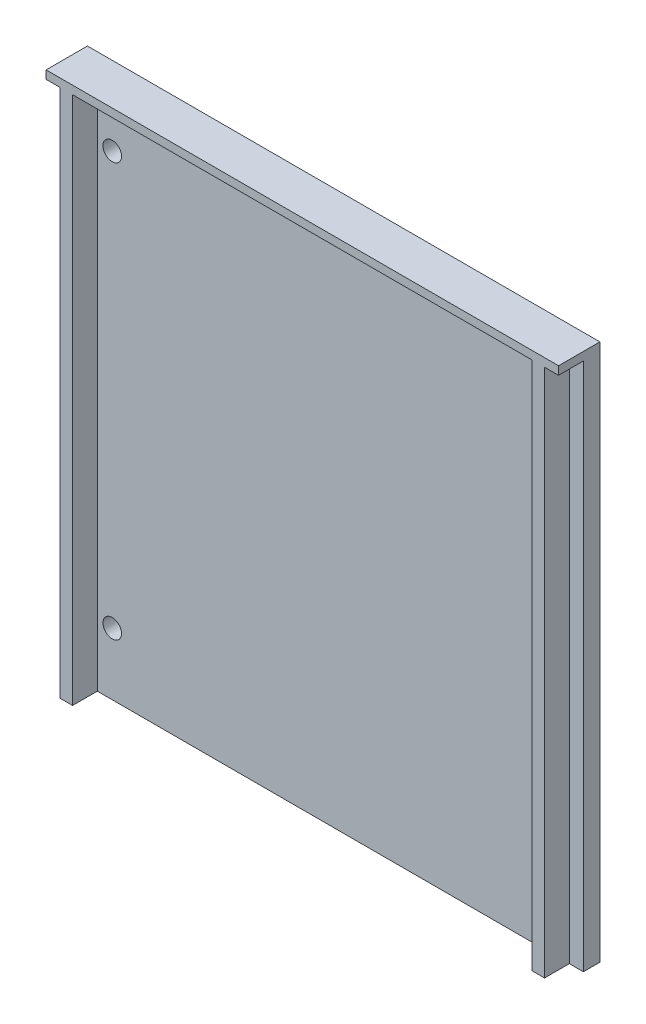
ISO-10303-21;
HEADER;
FILE_DESCRIPTION(('STEP AP214'),'2;1');
FILE_NAME('part.step','',(''),(''),'','','');
FILE_SCHEMA(('AUTOMOTIVE_DESIGN { 1 0 10303 214 1 1 1 1 }'));
ENDSEC;
DATA;
#1=APPLICATION_CONTEXT('core data for automotive mechanical design processes');
#2=APPLICATION_PROTOCOL_DEFINITION('international standard','automotive_design',2000,#1);
#3=PRODUCT_CONTEXT('',#1,'mechanical');
#4=PRODUCT('Part','Part','',(#3));
#5=PRODUCT_RELATED_PRODUCT_CATEGORY('part','',(#4));
#6=PRODUCT_DEFINITION_FORMATION('','',#4);
#7=PRODUCT_DEFINITION_CONTEXT('part definition',#1,'design');
#8=PRODUCT_DEFINITION('design','',#6,#7);
#9=PRODUCT_DEFINITION_SHAPE('','',#8);
#10=(LENGTH_UNIT() NAMED_UNIT(*) SI_UNIT(.MILLI.,.METRE.));
#11=(NAMED_UNIT(*) PLANE_ANGLE_UNIT() SI_UNIT($,.RADIAN.));
#12=(NAMED_UNIT(*) SI_UNIT($,.STERADIAN.) SOLID_ANGLE_UNIT());
#13=UNCERTAINTY_MEASURE_WITH_UNIT(LENGTH_MEASURE(1.E-05),#10,'distance_accuracy_value','');
#14=(GEOMETRIC_REPRESENTATION_CONTEXT(3) GLOBAL_UNCERTAINTY_ASSIGNED_CONTEXT((#13)) GLOBAL_UNIT_ASSIGNED_CONTEXT((#10,
#11,#12)) REPRESENTATION_CONTEXT('',''));
#15=CARTESIAN_POINT('',(0.,0.,0.));
#16=DIRECTION('',(0.,0.,1.));
#17=DIRECTION('',(1.,0.,0.));
#18=AXIS2_PLACEMENT_3D('',#15,#16,#17);
#19=CARTESIAN_POINT('',(-62.,63.,4.));
#20=DIRECTION('',(0.,1.,0.));
#21=DIRECTION('',(1.,0.,0.));
#22=AXIS2_PLACEMENT_3D('',#19,#20,#21);
#23=PLANE('',#22);
#24=DIRECTION('',(0.,0.,1.));
#25=VECTOR('',#24,1.);
#26=CARTESIAN_POINT('',(62.,63.,4.));
#27=LINE('',#26,#25);
#28=CARTESIAN_POINT('',(62.,63.,4.));
#29=VERTEX_POINT('',#28);
#30=CARTESIAN_POINT('',(62.,63.,10.));
#31=VERTEX_POINT('',#30);
#32=EDGE_CURVE('E10',#29,#31,#27,.T.);
#33=ORIENTED_EDGE('',*,*,#32,.T.);
#34=DIRECTION('',(1.,0.,0.));
#35=VECTOR('',#34,1.);
#36=CARTESIAN_POINT('',(-62.,63.,10.));
#37=LINE('',#36,#35);
#38=CARTESIAN_POINT('',(58.6,63.,10.));
#39=VERTEX_POINT('',#38);
#40=EDGE_CURVE('E164',#39,#31,#37,.T.);
#41=ORIENTED_EDGE('',*,*,#40,.F.);
#42=DIRECTION('',(0.,0.,1.));
#43=VECTOR('',#42,1.);
#44=CARTESIAN_POINT('',(58.6,63.,4.));
#45=LINE('',#44,#43);
#46=CARTESIAN_POINT('',(58.6,63.,4.));
#47=VERTEX_POINT('',#46);
#48=EDGE_CURVE('E145',#47,#39,#45,.T.);
#49=ORIENTED_EDGE('',*,*,#48,.F.);
#50=DIRECTION('',(1.,0.,0.));
#51=VECTOR('',#50,1.);
#52=CARTESIAN_POINT('',(-62.,63.,4.));
#53=LINE('',#52,#51);
#54=EDGE_CURVE('E146',#47,#29,#53,.T.);
#55=ORIENTED_EDGE('',*,*,#54,.T.);
#56=EDGE_LOOP('',(#33,#41,#49,#55));
#57=FACE_BOUND('',#56,.T.);
#58=ADVANCED_FACE('F16',(#57),#23,.F.);
#59=CARTESIAN_POINT('',(-62.,63.,4.));
#60=DIRECTION('',(0.,1.,0.));
#61=DIRECTION('',(1.,0.,0.));
#62=AXIS2_PLACEMENT_3D('',#59,#60,#61);
#63=PLANE('',#62);
#64=DIRECTION('',(0.,0.,1.));
#65=VECTOR('',#64,1.);
#66=CARTESIAN_POINT('',(55.6,63.,4.));
#67=LINE('',#66,#65);
#68=CARTESIAN_POINT('',(55.6,63.,4.));
#69=VERTEX_POINT('',#68);
#70=CARTESIAN_POINT('',(55.6,63.,10.));
#71=VERTEX_POINT('',#70);
#72=EDGE_CURVE('E100',#69,#71,#67,.T.);
#73=ORIENTED_EDGE('',*,*,#72,.T.);
#74=DIRECTION('',(1.,0.,0.));
#75=VECTOR('',#74,1.);
#76=CARTESIAN_POINT('',(-62.,63.,10.));
#77=LINE('',#76,#75);
#78=CARTESIAN_POINT('',(-55.6,63.,10.));
#79=VERTEX_POINT('',#78);
#80=EDGE_CURVE('E311',#79,#71,#77,.T.);
#81=ORIENTED_EDGE('',*,*,#80,.F.);
#82=DIRECTION('',(0.,0.,1.));
#83=VECTOR('',#82,1.);
#84=CARTESIAN_POINT('',(-55.6,63.,4.));
#85=LINE('',#84,#83);
#86=CARTESIAN_POINT('',(-55.6,63.,4.));
#87=VERTEX_POINT('',#86);
#88=EDGE_CURVE('E121',#87,#79,#85,.T.);
#89=ORIENTED_EDGE('',*,*,#88,.F.);
#90=DIRECTION('',(1.,0.,0.));
#91=VECTOR('',#90,1.);
#92=CARTESIAN_POINT('',(-62.,63.,4.));
#93=LINE('',#92,#91);
#94=EDGE_CURVE('E93',#87,#69,#93,.T.);
#95=ORIENTED_EDGE('',*,*,#94,.T.);
#96=EDGE_LOOP('',(#73,#81,#89,#95));
#97=FACE_BOUND('',#96,.T.);
#98=ADVANCED_FACE('F18',(#97),#63,.F.);
#99=CARTESIAN_POINT('',(52.,50.,-1.));
#100=DIRECTION('',(0.,0.,1.));
#101=DIRECTION('',(1.,0.,0.));
#102=AXIS2_PLACEMENT_3D('',#99,#100,#101);
#103=CYLINDRICAL_SURFACE('',#102,2.25);
#104=CARTESIAN_POINT('',(52.,50.,4.));
#105=DIRECTION('',(0.,0.,1.));
#106=DIRECTION('',(1.,0.,0.));
#107=AXIS2_PLACEMENT_3D('',#104,#105,#106);
#108=CIRCLE('',#107,2.25);
#109=CARTESIAN_POINT('',(54.25,50.,4.));
#110=VERTEX_POINT('',#109);
#111=EDGE_CURVE('E112',#110,#110,#108,.T.);
#112=ORIENTED_EDGE('',*,*,#111,.T.);
#113=EDGE_LOOP('',(#112));
#114=FACE_BOUND('',#113,.T.);
#115=CARTESIAN_POINT('',(52.,50.,0.));
#116=DIRECTION('',(0.,0.,1.));
#117=DIRECTION('',(1.,0.,0.));
#118=AXIS2_PLACEMENT_3D('',#115,#116,#117);
#119=CIRCLE('',#118,2.25);
#120=CARTESIAN_POINT('',(54.25,50.,0.));
#121=VERTEX_POINT('',#120);
#122=EDGE_CURVE('E292',#121,#121,#119,.T.);
#123=ORIENTED_EDGE('',*,*,#122,.F.);
#124=EDGE_LOOP('',(#123));
#125=FACE_BOUND('',#124,.T.);
#126=ADVANCED_FACE('F412',(#114,#125),#103,.F.);
#127=CARTESIAN_POINT('',(-52.,50.,-1.));
#128=DIRECTION('',(0.,0.,1.));
#129=DIRECTION('',(1.,0.,0.));
#130=AXIS2_PLACEMENT_3D('',#127,#128,#129);
#131=CYLINDRICAL_SURFACE('',#130,2.25);
#132=CARTESIAN_POINT('',(-52.,50.,4.));
#133=DIRECTION('',(0.,0.,1.));
#134=DIRECTION('',(1.,0.,0.));
#135=AXIS2_PLACEMENT_3D('',#132,#133,#134);
#136=CIRCLE('',#135,2.25);
#137=CARTESIAN_POINT('',(-49.75,50.,4.));
#138=VERTEX_POINT('',#137);
#139=EDGE_CURVE('E138',#138,#138,#136,.T.);
#140=ORIENTED_EDGE('',*,*,#139,.T.);
#141=EDGE_LOOP('',(#140));
#142=FACE_BOUND('',#141,.T.);
#143=CARTESIAN_POINT('',(-52.,50.,0.));
#144=DIRECTION('',(0.,0.,1.));
#145=DIRECTION('',(1.,0.,0.));
#146=AXIS2_PLACEMENT_3D('',#143,#144,#145);
#147=CIRCLE('',#146,2.25);
#148=CARTESIAN_POINT('',(-49.75,50.,0.));
#149=VERTEX_POINT('',#148);
#150=EDGE_CURVE('E288',#149,#149,#147,.T.);
#151=ORIENTED_EDGE('',*,*,#150,.F.);
#152=EDGE_LOOP('',(#151));
#153=FACE_BOUND('',#152,.T.);
#154=ADVANCED_FACE('F423',(#142,#153),#131,.F.);
#155=CARTESIAN_POINT('',(52.,-50.,-1.));
#156=DIRECTION('',(0.,0.,1.));
#157=DIRECTION('',(1.,0.,0.));
#158=AXIS2_PLACEMENT_3D('',#155,#156,#157);
#159=CYLINDRICAL_SURFACE('',#158,2.25);
#160=CARTESIAN_POINT('',(52.,-50.,4.));
#161=DIRECTION('',(0.,0.,1.));
#162=DIRECTION('',(1.,0.,0.));
#163=AXIS2_PLACEMENT_3D('',#160,#161,#162);
#164=CIRCLE('',#163,2.25);
#165=CARTESIAN_POINT('',(54.25,-50.,4.));
#166=VERTEX_POINT('',#165);
#167=EDGE_CURVE('E134',#166,#166,#164,.T.);
#168=ORIENTED_EDGE('',*,*,#167,.T.);
#169=EDGE_LOOP('',(#168));
#170=FACE_BOUND('',#169,.T.);
#171=CARTESIAN_POINT('',(52.,-50.,0.));
#172=DIRECTION('',(0.,0.,1.));
#173=DIRECTION('',(1.,0.,0.));
#174=AXIS2_PLACEMENT_3D('',#171,#172,#173);
#175=CIRCLE('',#174,2.25);
#176=CARTESIAN_POINT('',(54.25,-50.,0.));
#177=VERTEX_POINT('',#176);
#178=EDGE_CURVE('E284',#177,#177,#175,.T.);
#179=ORIENTED_EDGE('',*,*,#178,.F.);
#180=EDGE_LOOP('',(#179));
#181=FACE_BOUND('',#180,.T.);
#182=ADVANCED_FACE('F403',(#170,#181),#159,.F.);
#183=CARTESIAN_POINT('',(-52.,-50.,-1.));
#184=DIRECTION('',(0.,0.,1.));
#185=DIRECTION('',(1.,0.,0.));
#186=AXIS2_PLACEMENT_3D('',#183,#184,#185);
#187=CYLINDRICAL_SURFACE('',#186,2.25);
#188=CARTESIAN_POINT('',(-52.,-50.,4.));
#189=DIRECTION('',(0.,0.,1.));
#190=DIRECTION('',(1.,0.,0.));
#191=AXIS2_PLACEMENT_3D('',#188,#189,#190);
#192=CIRCLE('',#191,2.25);
#193=CARTESIAN_POINT('',(-49.75,-50.,4.));
#194=VERTEX_POINT('',#193);
#195=EDGE_CURVE('E119',#194,#194,#192,.T.);
#196=ORIENTED_EDGE('',*,*,#195,.T.);
#197=EDGE_LOOP('',(#196));
#198=FACE_BOUND('',#197,.T.);
#199=CARTESIAN_POINT('',(-52.,-50.,0.));
#200=DIRECTION('',(0.,0.,1.));
#201=DIRECTION('',(1.,0.,0.));
#202=AXIS2_PLACEMENT_3D('',#199,#200,#201);
#203=CIRCLE('',#202,2.25);
#204=CARTESIAN_POINT('',(-49.75,-50.,0.));
#205=VERTEX_POINT('',#204);
#206=EDGE_CURVE('E280',#205,#205,#203,.T.);
#207=ORIENTED_EDGE('',*,*,#206,.F.);
#208=EDGE_LOOP('',(#207));
#209=FACE_BOUND('',#208,.T.);
#210=ADVANCED_FACE('F395',(#198,#209),#187,.F.);
#211=CARTESIAN_POINT('',(-62.,63.,4.));
#212=DIRECTION('',(0.,1.,0.));
#213=DIRECTION('',(1.,0.,0.));
#214=AXIS2_PLACEMENT_3D('',#211,#212,#213);
#215=PLANE('',#214);
#216=DIRECTION('',(0.,0.,1.));
#217=VECTOR('',#216,1.);
#218=CARTESIAN_POINT('',(-58.6,63.,4.));
#219=LINE('',#218,#217);
#220=CARTESIAN_POINT('',(-58.6,63.,4.));
#221=VERTEX_POINT('',#220);
#222=CARTESIAN_POINT('',(-58.6,63.,10.));
#223=VERTEX_POINT('',#222);
#224=EDGE_CURVE('E232',#221,#223,#219,.T.);
#225=ORIENTED_EDGE('',*,*,#224,.T.);
#226=DIRECTION('',(1.,0.,0.));
#227=VECTOR('',#226,1.);
#228=CARTESIAN_POINT('',(-62.,63.,10.));
#229=LINE('',#228,#227);
#230=CARTESIAN_POINT('',(-62.,63.,10.));
#231=VERTEX_POINT('',#230);
#232=EDGE_CURVE('E263',#231,#223,#229,.T.);
#233=ORIENTED_EDGE('',*,*,#232,.F.);
#234=DIRECTION('',(0.,0.,1.));
#235=VECTOR('',#234,1.);
#236=CARTESIAN_POINT('',(-62.,63.,4.));
#237=LINE('',#236,#235);
#238=CARTESIAN_POINT('',(-62.,63.,4.));
#239=VERTEX_POINT('',#238);
#240=EDGE_CURVE('E375',#239,#231,#237,.T.);
#241=ORIENTED_EDGE('',*,*,#240,.F.);
#242=DIRECTION('',(1.,0.,0.));
#243=VECTOR('',#242,1.);
#244=CARTESIAN_POINT('',(-62.,63.,4.));
#245=LINE('',#244,#243);
#246=EDGE_CURVE('E237',#239,#221,#245,.T.);
#247=ORIENTED_EDGE('',*,*,#246,.T.);
#248=EDGE_LOOP('',(#225,#233,#241,#247));
#249=FACE_BOUND('',#248,.T.);
#250=ADVANCED_FACE('F393',(#249),#215,.F.);
#251=CARTESIAN_POINT('',(62.,-65.,0.));
#252=DIRECTION('',(1.,0.,0.));
#253=DIRECTION('',(0.,1.,0.));
#254=AXIS2_PLACEMENT_3D('',#251,#252,#253);
#255=PLANE('',#254);
#256=DIRECTION('',(0.,0.,1.));
#257=VECTOR('',#256,1.);
#258=CARTESIAN_POINT('',(62.,-65.,0.));
#259=LINE('',#258,#257);
#260=CARTESIAN_POINT('',(62.,-65.,0.));
#261=VERTEX_POINT('',#260);
#262=CARTESIAN_POINT('',(62.,-65.,4.));
#263=VERTEX_POINT('',#262);
#264=EDGE_CURVE('E342',#261,#263,#259,.T.);
#265=ORIENTED_EDGE('',*,*,#264,.F.);
#266=DIRECTION('',(0.,1.,0.));
#267=VECTOR('',#266,1.);
#268=CARTESIAN_POINT('',(62.,-65.,0.));
#269=LINE('',#268,#267);
#270=CARTESIAN_POINT('',(62.,65.,0.));
#271=VERTEX_POINT('',#270);
#272=EDGE_CURVE('E279',#261,#271,#269,.T.);
#273=ORIENTED_EDGE('',*,*,#272,.T.);
#274=DIRECTION('',(0.,0.,-1.));
#275=VECTOR('',#274,1.);
#276=CARTESIAN_POINT('',(62.,65.,10.));
#277=LINE('',#276,#275);
#278=CARTESIAN_POINT('',(62.,65.,10.));
#279=VERTEX_POINT('',#278);
#280=EDGE_CURVE('E275',#279,#271,#277,.T.);
#281=ORIENTED_EDGE('',*,*,#280,.F.);
#282=DIRECTION('',(0.,1.,0.));
#283=VECTOR('',#282,1.);
#284=CARTESIAN_POINT('',(62.,63.,10.));
#285=LINE('',#284,#283);
#286=EDGE_CURVE('E265',#31,#279,#285,.T.);
#287=ORIENTED_EDGE('',*,*,#286,.F.);
#288=ORIENTED_EDGE('',*,*,#32,.F.);
#289=DIRECTION('',(0.,1.,0.));
#290=VECTOR('',#289,1.);
#291=CARTESIAN_POINT('',(62.,-65.,4.));
#292=LINE('',#291,#290);
#293=EDGE_CURVE('E26',#263,#29,#292,.T.);
#294=ORIENTED_EDGE('',*,*,#293,.F.);
#295=EDGE_LOOP('',(#265,#273,#281,#287,#288,#294));
#296=FACE_BOUND('',#295,.T.);
#297=ADVANCED_FACE('F354',(#296),#255,.T.);
#298=CARTESIAN_POINT('',(-62.,-65.,4.));
#299=DIRECTION('',(0.,0.,1.));
#300=DIRECTION('',(1.,0.,0.));
#301=AXIS2_PLACEMENT_3D('',#298,#299,#300);
#302=PLANE('',#301);
#303=ORIENTED_EDGE('',*,*,#54,.F.);
#304=DIRECTION('',(0.,1.,0.));
#305=VECTOR('',#304,1.);
#306=CARTESIAN_POINT('',(58.6,-65.,4.));
#307=LINE('',#306,#305);
#308=CARTESIAN_POINT('',(58.6,-65.,4.));
#309=VERTEX_POINT('',#308);
#310=EDGE_CURVE('E111',#309,#47,#307,.T.);
#311=ORIENTED_EDGE('',*,*,#310,.F.);
#312=DIRECTION('',(1.,0.,0.));
#313=VECTOR('',#312,1.);
#314=CARTESIAN_POINT('',(-62.,-65.,4.));
#315=LINE('',#314,#313);
#316=EDGE_CURVE('E158',#309,#263,#315,.T.);
#317=ORIENTED_EDGE('',*,*,#316,.T.);
#318=ORIENTED_EDGE('',*,*,#293,.T.);
#319=EDGE_LOOP('',(#303,#311,#317,#318));
#320=FACE_BOUND('',#319,.T.);
#321=ADVANCED_FACE('F153',(#320),#302,.T.);
#322=CARTESIAN_POINT('',(58.6,-65.,4.));
#323=DIRECTION('',(1.,0.,0.));
#324=DIRECTION('',(0.,1.,0.));
#325=AXIS2_PLACEMENT_3D('',#322,#323,#324);
#326=PLANE('',#325);
#327=DIRECTION('',(0.,1.,0.));
#328=VECTOR('',#327,1.);
#329=CARTESIAN_POINT('',(58.6,-65.,10.));
#330=LINE('',#329,#328);
#331=CARTESIAN_POINT('',(58.6,-65.,10.));
#332=VERTEX_POINT('',#331);
#333=EDGE_CURVE('E293',#332,#39,#330,.T.);
#334=ORIENTED_EDGE('',*,*,#333,.F.);
#335=DIRECTION('',(0.,0.,1.));
#336=VECTOR('',#335,1.);
#337=CARTESIAN_POINT('',(58.6,-65.,4.));
#338=LINE('',#337,#336);
#339=EDGE_CURVE('E174',#309,#332,#338,.T.);
#340=ORIENTED_EDGE('',*,*,#339,.F.);
#341=ORIENTED_EDGE('',*,*,#310,.T.);
#342=ORIENTED_EDGE('',*,*,#48,.T.);
#343=EDGE_LOOP('',(#334,#340,#341,#342));
#344=FACE_BOUND('',#343,.T.);
#345=ADVANCED_FACE('F171',(#344),#326,.T.);
#346=CARTESIAN_POINT('',(55.6,-65.,4.));
#347=DIRECTION('',(1.,0.,0.));
#348=DIRECTION('',(0.,1.,0.));
#349=AXIS2_PLACEMENT_3D('',#346,#347,#348);
#350=PLANE('',#349);
#351=ORIENTED_EDGE('',*,*,#72,.F.);
#352=DIRECTION('',(0.,1.,0.));
#353=VECTOR('',#352,1.);
#354=CARTESIAN_POINT('',(55.6,-65.,4.));
#355=LINE('',#354,#353);
#356=CARTESIAN_POINT('',(55.6,-65.,4.));
#357=VERTEX_POINT('',#356);
#358=EDGE_CURVE('E103',#357,#69,#355,.T.);
#359=ORIENTED_EDGE('',*,*,#358,.F.);
#360=DIRECTION('',(0.,0.,1.));
#361=VECTOR('',#360,1.);
#362=CARTESIAN_POINT('',(55.6,-65.,4.));
#363=LINE('',#362,#361);
#364=CARTESIAN_POINT('',(55.6,-65.,10.));
#365=VERTEX_POINT('',#364);
#366=EDGE_CURVE('E327',#357,#365,#363,.T.);
#367=ORIENTED_EDGE('',*,*,#366,.T.);
#368=DIRECTION('',(0.,1.,0.));
#369=VECTOR('',#368,1.);
#370=CARTESIAN_POINT('',(55.6,-65.,10.));
#371=LINE('',#370,#369);
#372=EDGE_CURVE('E106',#365,#71,#371,.T.);
#373=ORIENTED_EDGE('',*,*,#372,.T.);
#374=EDGE_LOOP('',(#351,#359,#367,#373));
#375=FACE_BOUND('',#374,.T.);
#376=ADVANCED_FACE('F101',(#375),#350,.F.);
#377=CARTESIAN_POINT('',(-62.,-65.,4.));
#378=DIRECTION('',(0.,0.,1.));
#379=DIRECTION('',(1.,0.,0.));
#380=AXIS2_PLACEMENT_3D('',#377,#378,#379);
#381=PLANE('',#380);
#382=ORIENTED_EDGE('',*,*,#111,.F.);
#383=EDGE_LOOP('',(#382));
#384=FACE_BOUND('',#383,.T.);
#385=ORIENTED_EDGE('',*,*,#139,.F.);
#386=EDGE_LOOP('',(#385));
#387=FACE_BOUND('',#386,.T.);
#388=ORIENTED_EDGE('',*,*,#167,.F.);
#389=EDGE_LOOP('',(#388));
#390=FACE_BOUND('',#389,.T.);
#391=ORIENTED_EDGE('',*,*,#195,.F.);
#392=EDGE_LOOP('',(#391));
#393=FACE_BOUND('',#392,.T.);
#394=ORIENTED_EDGE('',*,*,#94,.F.);
#395=DIRECTION('',(0.,1.,0.));
#396=VECTOR('',#395,1.);
#397=CARTESIAN_POINT('',(-55.6,-65.,4.));
#398=LINE('',#397,#396);
#399=CARTESIAN_POINT('',(-55.6,-65.,4.));
#400=VERTEX_POINT('',#399);
#401=EDGE_CURVE('E127',#400,#87,#398,.T.);
#402=ORIENTED_EDGE('',*,*,#401,.F.);
#403=DIRECTION('',(1.,0.,0.));
#404=VECTOR('',#403,1.);
#405=CARTESIAN_POINT('',(-62.,-65.,4.));
#406=LINE('',#405,#404);
#407=EDGE_CURVE('E116',#400,#357,#406,.T.);
#408=ORIENTED_EDGE('',*,*,#407,.T.);
#409=ORIENTED_EDGE('',*,*,#358,.T.);
#410=EDGE_LOOP('',(#394,#402,#408,#409));
#411=FACE_BOUND('',#410,.T.);
#412=ADVANCED_FACE('F114',(#384,#387,#390,#393,#411),#381,.T.);
#413=CARTESIAN_POINT('',(-55.6,-65.,4.));
#414=DIRECTION('',(1.,0.,0.));
#415=DIRECTION('',(0.,1.,0.));
#416=AXIS2_PLACEMENT_3D('',#413,#414,#415);
#417=PLANE('',#416);
#418=DIRECTION('',(0.,1.,0.));
#419=VECTOR('',#418,1.);
#420=CARTESIAN_POINT('',(-55.6,-65.,10.));
#421=LINE('',#420,#419);
#422=CARTESIAN_POINT('',(-55.6,-65.,10.));
#423=VERTEX_POINT('',#422);
#424=EDGE_CURVE('E307',#423,#79,#421,.T.);
#425=ORIENTED_EDGE('',*,*,#424,.F.);
#426=DIRECTION('',(0.,0.,1.));
#427=VECTOR('',#426,1.);
#428=CARTESIAN_POINT('',(-55.6,-65.,4.));
#429=LINE('',#428,#427);
#430=EDGE_CURVE('E259',#400,#423,#429,.T.);
#431=ORIENTED_EDGE('',*,*,#430,.F.);
#432=ORIENTED_EDGE('',*,*,#401,.T.);
#433=ORIENTED_EDGE('',*,*,#88,.T.);
#434=EDGE_LOOP('',(#425,#431,#432,#433));
#435=FACE_BOUND('',#434,.T.);
#436=ADVANCED_FACE('F323',(#435),#417,.T.);
#437=CARTESIAN_POINT('',(-58.6,-65.,10.));
#438=DIRECTION('',(0.,0.,1.));
#439=DIRECTION('',(1.,0.,0.));
#440=AXIS2_PLACEMENT_3D('',#437,#438,#439);
#441=PLANE('',#440);
#442=DIRECTION('',(0.,1.,0.));
#443=VECTOR('',#442,1.);
#444=CARTESIAN_POINT('',(-58.6,-65.,10.));
#445=LINE('',#444,#443);
#446=CARTESIAN_POINT('',(-58.6,-65.,10.));
#447=VERTEX_POINT('',#446);
#448=EDGE_CURVE('E304',#447,#223,#445,.T.);
#449=ORIENTED_EDGE('',*,*,#448,.F.);
#450=DIRECTION('',(1.,0.,0.));
#451=VECTOR('',#450,1.);
#452=CARTESIAN_POINT('',(-58.6,-65.,10.));
#453=LINE('',#452,#451);
#454=EDGE_CURVE('E253',#447,#423,#453,.T.);
#455=ORIENTED_EDGE('',*,*,#454,.T.);
#456=ORIENTED_EDGE('',*,*,#424,.T.);
#457=ORIENTED_EDGE('',*,*,#80,.T.);
#458=ORIENTED_EDGE('',*,*,#372,.F.);
#459=DIRECTION('',(1.,0.,0.));
#460=VECTOR('',#459,1.);
#461=CARTESIAN_POINT('',(55.6,-65.,10.));
#462=LINE('',#461,#460);
#463=EDGE_CURVE('E334',#365,#332,#462,.T.);
#464=ORIENTED_EDGE('',*,*,#463,.T.);
#465=ORIENTED_EDGE('',*,*,#333,.T.);
#466=ORIENTED_EDGE('',*,*,#40,.T.);
#467=ORIENTED_EDGE('',*,*,#286,.T.);
#468=DIRECTION('',(1.,0.,0.));
#469=VECTOR('',#468,1.);
#470=CARTESIAN_POINT('',(-62.,65.,10.));
#471=LINE('',#470,#469);
#472=CARTESIAN_POINT('',(-62.,65.,10.));
#473=VERTEX_POINT('',#472);
#474=EDGE_CURVE('E271',#473,#279,#471,.T.);
#475=ORIENTED_EDGE('',*,*,#474,.F.);
#476=DIRECTION('',(0.,1.,0.));
#477=VECTOR('',#476,1.);
#478=CARTESIAN_POINT('',(-62.,63.,10.));
#479=LINE('',#478,#477);
#480=EDGE_CURVE('E369',#231,#473,#479,.T.);
#481=ORIENTED_EDGE('',*,*,#480,.F.);
#482=ORIENTED_EDGE('',*,*,#232,.T.);
#483=EDGE_LOOP('',(#449,#455,#456,#457,#458,#464,#465,#466,#467,#475,#481,#482));
#484=FACE_BOUND('',#483,.T.);
#485=ADVANCED_FACE('F380',(#484),#441,.T.);
#486=CARTESIAN_POINT('',(-58.6,-65.,4.));
#487=DIRECTION('',(1.,0.,0.));
#488=DIRECTION('',(0.,1.,0.));
#489=AXIS2_PLACEMENT_3D('',#486,#487,#488);
#490=PLANE('',#489);
#491=ORIENTED_EDGE('',*,*,#224,.F.);
#492=DIRECTION('',(0.,1.,0.));
#493=VECTOR('',#492,1.);
#494=CARTESIAN_POINT('',(-58.6,-65.,4.));
#495=LINE('',#494,#493);
#496=CARTESIAN_POINT('',(-58.6,-65.,4.));
#497=VERTEX_POINT('',#496);
#498=EDGE_CURVE('E224',#497,#221,#495,.T.);
#499=ORIENTED_EDGE('',*,*,#498,.F.);
#500=DIRECTION('',(0.,0.,1.));
#501=VECTOR('',#500,1.);
#502=CARTESIAN_POINT('',(-58.6,-65.,4.));
#503=LINE('',#502,#501);
#504=EDGE_CURVE('E229',#497,#447,#503,.T.);
#505=ORIENTED_EDGE('',*,*,#504,.T.);
#506=ORIENTED_EDGE('',*,*,#448,.T.);
#507=EDGE_LOOP('',(#491,#499,#505,#506));
#508=FACE_BOUND('',#507,.T.);
#509=ADVANCED_FACE('F226',(#508),#490,.F.);
#510=CARTESIAN_POINT('',(-62.,-65.,0.));
#511=DIRECTION('',(0.,0.,1.));
#512=DIRECTION('',(1.,0.,0.));
#513=AXIS2_PLACEMENT_3D('',#510,#511,#512);
#514=PLANE('',#513);
#515=ORIENTED_EDGE('',*,*,#122,.T.);
#516=EDGE_LOOP('',(#515));
#517=FACE_BOUND('',#516,.T.);
#518=ORIENTED_EDGE('',*,*,#150,.T.);
#519=EDGE_LOOP('',(#518));
#520=FACE_BOUND('',#519,.T.);
#521=ORIENTED_EDGE('',*,*,#178,.T.);
#522=EDGE_LOOP('',(#521));
#523=FACE_BOUND('',#522,.T.);
#524=ORIENTED_EDGE('',*,*,#206,.T.);
#525=EDGE_LOOP('',(#524));
#526=FACE_BOUND('',#525,.T.);
#527=DIRECTION('',(1.,0.,0.));
#528=VECTOR('',#527,1.);
#529=CARTESIAN_POINT('',(-62.,65.,0.));
#530=LINE('',#529,#528);
#531=CARTESIAN_POINT('',(-62.,65.,0.));
#532=VERTEX_POINT('',#531);
#533=EDGE_CURVE('E236',#532,#271,#530,.T.);
#534=ORIENTED_EDGE('',*,*,#533,.T.);
#535=ORIENTED_EDGE('',*,*,#272,.F.);
#536=DIRECTION('',(1.,0.,0.));
#537=VECTOR('',#536,1.);
#538=CARTESIAN_POINT('',(-62.,-65.,0.));
#539=LINE('',#538,#537);
#540=CARTESIAN_POINT('',(-62.,-65.,0.));
#541=VERTEX_POINT('',#540);
#542=EDGE_CURVE('E248',#541,#261,#539,.T.);
#543=ORIENTED_EDGE('',*,*,#542,.F.);
#544=DIRECTION('',(0.,1.,0.));
#545=VECTOR('',#544,1.);
#546=CARTESIAN_POINT('',(-62.,-65.,0.));
#547=LINE('',#546,#545);
#548=EDGE_CURVE('E338',#541,#532,#547,.T.);
#549=ORIENTED_EDGE('',*,*,#548,.T.);
#550=EDGE_LOOP('',(#534,#535,#543,#549));
#551=FACE_BOUND('',#550,.T.);
#552=ADVANCED_FACE('F360',(#517,#520,#523,#526,#551),#514,.F.);
#553=CARTESIAN_POINT('',(-62.,65.,0.));
#554=DIRECTION('',(0.,1.,0.));
#555=DIRECTION('',(1.,0.,0.));
#556=AXIS2_PLACEMENT_3D('',#553,#554,#555);
#557=PLANE('',#556);
#558=ORIENTED_EDGE('',*,*,#533,.F.);
#559=DIRECTION('',(0.,0.,-1.));
#560=VECTOR('',#559,1.);
#561=CARTESIAN_POINT('',(-62.,65.,10.));
#562=LINE('',#561,#560);
#563=EDGE_CURVE('E364',#473,#532,#562,.T.);
#564=ORIENTED_EDGE('',*,*,#563,.F.);
#565=ORIENTED_EDGE('',*,*,#474,.T.);
#566=ORIENTED_EDGE('',*,*,#280,.T.);
#567=EDGE_LOOP('',(#558,#564,#565,#566));
#568=FACE_BOUND('',#567,.T.);
#569=ADVANCED_FACE('F357',(#568),#557,.T.);
#570=CARTESIAN_POINT('',(-62.,-65.,4.));
#571=DIRECTION('',(0.,0.,1.));
#572=DIRECTION('',(1.,0.,0.));
#573=AXIS2_PLACEMENT_3D('',#570,#571,#572);
#574=PLANE('',#573);
#575=ORIENTED_EDGE('',*,*,#246,.F.);
#576=DIRECTION('',(0.,1.,0.));
#577=VECTOR('',#576,1.);
#578=CARTESIAN_POINT('',(-62.,-65.,4.));
#579=LINE('',#578,#577);
#580=CARTESIAN_POINT('',(-62.,-65.,4.));
#581=VERTEX_POINT('',#580);
#582=EDGE_CURVE('E243',#581,#239,#579,.T.);
#583=ORIENTED_EDGE('',*,*,#582,.F.);
#584=DIRECTION('',(1.,0.,0.));
#585=VECTOR('',#584,1.);
#586=CARTESIAN_POINT('',(-62.,-65.,4.));
#587=LINE('',#586,#585);
#588=EDGE_CURVE('E240',#581,#497,#587,.T.);
#589=ORIENTED_EDGE('',*,*,#588,.T.);
#590=ORIENTED_EDGE('',*,*,#498,.T.);
#591=EDGE_LOOP('',(#575,#583,#589,#590));
#592=FACE_BOUND('',#591,.T.);
#593=ADVANCED_FACE('F241',(#592),#574,.T.);
#594=CARTESIAN_POINT('',(-62.,-65.,0.));
#595=DIRECTION('',(0.,1.,0.));
#596=DIRECTION('',(1.,0.,0.));
#597=AXIS2_PLACEMENT_3D('',#594,#595,#596);
#598=PLANE('',#597);
#599=ORIENTED_EDGE('',*,*,#264,.T.);
#600=ORIENTED_EDGE('',*,*,#316,.F.);
#601=ORIENTED_EDGE('',*,*,#339,.T.);
#602=ORIENTED_EDGE('',*,*,#463,.F.);
#603=ORIENTED_EDGE('',*,*,#366,.F.);
#604=ORIENTED_EDGE('',*,*,#407,.F.);
#605=ORIENTED_EDGE('',*,*,#430,.T.);
#606=ORIENTED_EDGE('',*,*,#454,.F.);
#607=ORIENTED_EDGE('',*,*,#504,.F.);
#608=ORIENTED_EDGE('',*,*,#588,.F.);
#609=DIRECTION('',(0.,0.,1.));
#610=VECTOR('',#609,1.);
#611=CARTESIAN_POINT('',(-62.,-65.,0.));
#612=LINE('',#611,#610);
#613=EDGE_CURVE('E340',#541,#581,#612,.T.);
#614=ORIENTED_EDGE('',*,*,#613,.F.);
#615=ORIENTED_EDGE('',*,*,#542,.T.);
#616=EDGE_LOOP('',(#599,#600,#601,#602,#603,#604,#605,#606,#607,#608,#614,#615));
#617=FACE_BOUND('',#616,.T.);
#618=ADVANCED_FACE('F250',(#617),#598,.F.);
#619=CARTESIAN_POINT('',(-62.,-65.,0.));
#620=DIRECTION('',(1.,0.,0.));
#621=DIRECTION('',(0.,1.,0.));
#622=AXIS2_PLACEMENT_3D('',#619,#620,#621);
#623=PLANE('',#622);
#624=ORIENTED_EDGE('',*,*,#582,.T.);
#625=ORIENTED_EDGE('',*,*,#240,.T.);
#626=ORIENTED_EDGE('',*,*,#480,.T.);
#627=ORIENTED_EDGE('',*,*,#563,.T.);
#628=ORIENTED_EDGE('',*,*,#548,.F.);
#629=ORIENTED_EDGE('',*,*,#613,.T.);
#630=EDGE_LOOP('',(#624,#625,#626,#627,#628,#629));
#631=FACE_BOUND('',#630,.T.);
#632=ADVANCED_FACE('F366',(#631),#623,.F.);
#633=CLOSED_SHELL('',(#58,#98,#126,#154,#182,#210,#250,#297,#321,#345,#376,#412,#436,#485,#509,
#552,#569,#593,#618,#632));
#634=MANIFOLD_SOLID_BREP('B1',#633);
#635=ADVANCED_BREP_SHAPE_REPRESENTATION('',(#18,#634),#14);
#636=SHAPE_DEFINITION_REPRESENTATION(#9,#635);
ENDSEC;
END-ISO-10303-21;
